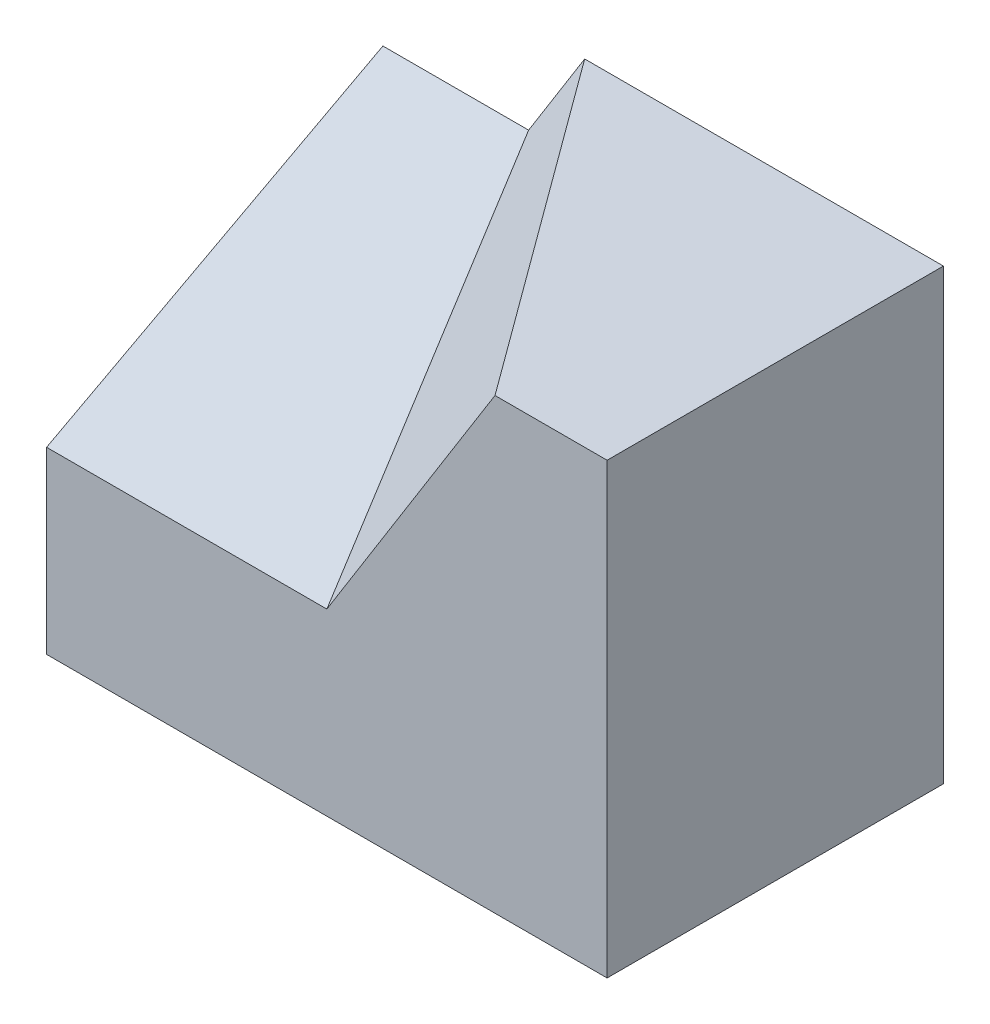
ISO-10303-21;
HEADER;
FILE_DESCRIPTION(('STEP AP214'),'2;1');
FILE_NAME('part.step','',(''),(''),'','','');
FILE_SCHEMA(('AUTOMOTIVE_DESIGN { 1 0 10303 214 1 1 1 1 }'));
ENDSEC;
DATA;
#1=APPLICATION_CONTEXT('core data for automotive mechanical design processes');
#2=APPLICATION_PROTOCOL_DEFINITION('international standard','automotive_design',2000,#1);
#3=PRODUCT_CONTEXT('',#1,'mechanical');
#4=PRODUCT('Part','Part','',(#3));
#5=PRODUCT_RELATED_PRODUCT_CATEGORY('part','',(#4));
#6=PRODUCT_DEFINITION_FORMATION('','',#4);
#7=PRODUCT_DEFINITION_CONTEXT('part definition',#1,'design');
#8=PRODUCT_DEFINITION('design','',#6,#7);
#9=PRODUCT_DEFINITION_SHAPE('','',#8);
#10=(LENGTH_UNIT() NAMED_UNIT(*) SI_UNIT(.MILLI.,.METRE.));
#11=(NAMED_UNIT(*) PLANE_ANGLE_UNIT() SI_UNIT($,.RADIAN.));
#12=(NAMED_UNIT(*) SI_UNIT($,.STERADIAN.) SOLID_ANGLE_UNIT());
#13=UNCERTAINTY_MEASURE_WITH_UNIT(LENGTH_MEASURE(1.E-05),#10,'distance_accuracy_value','');
#14=(GEOMETRIC_REPRESENTATION_CONTEXT(3) GLOBAL_UNCERTAINTY_ASSIGNED_CONTEXT((#13)) GLOBAL_UNIT_ASSIGNED_CONTEXT((#10,
#11,#12)) REPRESENTATION_CONTEXT('',''));
#15=CARTESIAN_POINT('',(0.,0.,0.));
#16=DIRECTION('',(0.,0.,1.));
#17=DIRECTION('',(1.,0.,0.));
#18=AXIS2_PLACEMENT_3D('',#15,#16,#17);
#19=CARTESIAN_POINT('',(0.,0.,60.));
#20=DIRECTION('',(0.,0.,1.));
#21=DIRECTION('',(1.,0.,0.));
#22=AXIS2_PLACEMENT_3D('',#19,#20,#21);
#23=PLANE('',#22);
#24=DIRECTION('',(0.,-1.,0.));
#25=VECTOR('',#24,1.);
#26=CARTESIAN_POINT('',(0.,32.,60.));
#27=LINE('',#26,#25);
#28=CARTESIAN_POINT('',(0.,32.,60.));
#29=VERTEX_POINT('',#28);
#30=CARTESIAN_POINT('',(0.,0.,60.));
#31=VERTEX_POINT('',#30);
#32=EDGE_CURVE('E289',#29,#31,#27,.T.);
#33=ORIENTED_EDGE('',*,*,#32,.T.);
#34=DIRECTION('',(1.,0.,0.));
#35=VECTOR('',#34,1.);
#36=CARTESIAN_POINT('',(0.,0.,60.));
#37=LINE('',#36,#35);
#38=CARTESIAN_POINT('',(100.,0.,60.));
#39=VERTEX_POINT('',#38);
#40=EDGE_CURVE('E148',#31,#39,#37,.T.);
#41=ORIENTED_EDGE('',*,*,#40,.T.);
#42=DIRECTION('',(0.,1.,0.));
#43=VECTOR('',#42,1.);
#44=CARTESIAN_POINT('',(100.,0.,60.));
#45=LINE('',#44,#43);
#46=CARTESIAN_POINT('',(100.,80.,60.));
#47=VERTEX_POINT('',#46);
#48=EDGE_CURVE('E306',#39,#47,#45,.T.);
#49=ORIENTED_EDGE('',*,*,#48,.T.);
#50=DIRECTION('',(-1.,0.,0.));
#51=VECTOR('',#50,1.);
#52=CARTESIAN_POINT('',(100.,80.,60.));
#53=LINE('',#52,#51);
#54=CARTESIAN_POINT('',(80.,80.,60.));
#55=VERTEX_POINT('',#54);
#56=EDGE_CURVE('E316',#47,#55,#53,.T.);
#57=ORIENTED_EDGE('',*,*,#56,.T.);
#58=DIRECTION('',(-0.52999894000318,-0.847998304005088,0.));
#59=VECTOR('',#58,1.);
#60=CARTESIAN_POINT('',(80.,80.,60.));
#61=LINE('',#60,#59);
#62=CARTESIAN_POINT('',(50.,32.,60.));
#63=VERTEX_POINT('',#62);
#64=EDGE_CURVE('E67',#55,#63,#61,.T.);
#65=ORIENTED_EDGE('',*,*,#64,.T.);
#66=DIRECTION('',(-1.,0.,0.));
#67=VECTOR('',#66,1.);
#68=CARTESIAN_POINT('',(50.,32.,60.));
#69=LINE('',#68,#67);
#70=EDGE_CURVE('E12',#63,#29,#69,.T.);
#71=ORIENTED_EDGE('',*,*,#70,.T.);
#72=EDGE_LOOP('',(#33,#41,#49,#57,#65,#71));
#73=FACE_BOUND('',#72,.T.);
#74=ADVANCED_FACE('F57',(#73),#23,.T.);
#75=CARTESIAN_POINT('',(0.,0.,0.));
#76=DIRECTION('',(0.,0.,1.));
#77=DIRECTION('',(1.,0.,0.));
#78=AXIS2_PLACEMENT_3D('',#75,#76,#77);
#79=PLANE('',#78);
#80=DIRECTION('',(0.,-1.,0.));
#81=VECTOR('',#80,1.);
#82=CARTESIAN_POINT('',(0.,64.,0.));
#83=LINE('',#82,#81);
#84=CARTESIAN_POINT('',(0.,64.,0.));
#85=VERTEX_POINT('',#84);
#86=CARTESIAN_POINT('',(0.,0.,0.));
#87=VERTEX_POINT('',#86);
#88=EDGE_CURVE('E119',#85,#87,#83,.T.);
#89=ORIENTED_EDGE('',*,*,#88,.F.);
#90=DIRECTION('',(-1.,0.,0.));
#91=VECTOR('',#90,1.);
#92=CARTESIAN_POINT('',(26.,64.,0.));
#93=LINE('',#92,#91);
#94=CARTESIAN_POINT('',(26.,64.,0.));
#95=VERTEX_POINT('',#94);
#96=EDGE_CURVE('E336',#95,#85,#93,.T.);
#97=ORIENTED_EDGE('',*,*,#96,.F.);
#98=DIRECTION('',(-0.52999894000318,-0.847998304005088,0.));
#99=VECTOR('',#98,1.);
#100=CARTESIAN_POINT('',(36.,80.,0.));
#101=LINE('',#100,#99);
#102=CARTESIAN_POINT('',(36.,80.,0.));
#103=VERTEX_POINT('',#102);
#104=EDGE_CURVE('E339',#103,#95,#101,.T.);
#105=ORIENTED_EDGE('',*,*,#104,.F.);
#106=DIRECTION('',(-1.,0.,0.));
#107=VECTOR('',#106,1.);
#108=CARTESIAN_POINT('',(100.,80.,0.));
#109=LINE('',#108,#107);
#110=CARTESIAN_POINT('',(100.,80.,0.));
#111=VERTEX_POINT('',#110);
#112=EDGE_CURVE('E355',#111,#103,#109,.T.);
#113=ORIENTED_EDGE('',*,*,#112,.F.);
#114=DIRECTION('',(0.,1.,0.));
#115=VECTOR('',#114,1.);
#116=CARTESIAN_POINT('',(100.,0.,0.));
#117=LINE('',#116,#115);
#118=CARTESIAN_POINT('',(100.,0.,0.));
#119=VERTEX_POINT('',#118);
#120=EDGE_CURVE('E122',#119,#111,#117,.T.);
#121=ORIENTED_EDGE('',*,*,#120,.F.);
#122=DIRECTION('',(1.,0.,0.));
#123=VECTOR('',#122,1.);
#124=CARTESIAN_POINT('',(0.,0.,0.));
#125=LINE('',#124,#123);
#126=EDGE_CURVE('E115',#87,#119,#125,.T.);
#127=ORIENTED_EDGE('',*,*,#126,.F.);
#128=EDGE_LOOP('',(#89,#97,#105,#113,#121,#127));
#129=FACE_BOUND('',#128,.T.);
#130=ADVANCED_FACE('F118',(#129),#79,.F.);
#131=CARTESIAN_POINT('',(0.,0.,0.));
#132=DIRECTION('',(0.,1.,0.));
#133=DIRECTION('',(0.,0.,1.));
#134=AXIS2_PLACEMENT_3D('',#131,#132,#133);
#135=PLANE('',#134);
#136=CARTESIAN_POINT('',(100.,0.,0.));
#137=DIRECTION('',(0.,0.,1.));
#138=VECTOR('',#137,1.);
#139=LINE('',#136,#138);
#140=EDGE_CURVE('E151',#119,#39,#139,.T.);
#141=ORIENTED_EDGE('',*,*,#140,.T.);
#142=ORIENTED_EDGE('',*,*,#40,.F.);
#143=CARTESIAN_POINT('',(0.,0.,0.));
#144=DIRECTION('',(0.,0.,1.));
#145=VECTOR('',#144,1.);
#146=LINE('',#143,#145);
#147=EDGE_CURVE('E136',#87,#31,#146,.T.);
#148=ORIENTED_EDGE('',*,*,#147,.F.);
#149=ORIENTED_EDGE('',*,*,#126,.T.);
#150=EDGE_LOOP('',(#141,#142,#148,#149));
#151=FACE_BOUND('',#150,.T.);
#152=ADVANCED_FACE('F146',(#151),#135,.F.);
#153=CARTESIAN_POINT('',(0.,0.,0.));
#154=DIRECTION('',(1.,0.,0.));
#155=DIRECTION('',(0.,0.,-1.));
#156=AXIS2_PLACEMENT_3D('',#153,#154,#155);
#157=PLANE('',#156);
#158=ORIENTED_EDGE('',*,*,#147,.T.);
#159=ORIENTED_EDGE('',*,*,#32,.F.);
#160=CARTESIAN_POINT('',(0.,64.,0.));
#161=DIRECTION('',(0.,-0.470588235294118,0.882352941176471));
#162=VECTOR('',#161,1.);
#163=LINE('',#160,#162);
#164=EDGE_CURVE('E139',#85,#29,#163,.T.);
#165=ORIENTED_EDGE('',*,*,#164,.F.);
#166=ORIENTED_EDGE('',*,*,#88,.T.);
#167=EDGE_LOOP('',(#158,#159,#165,#166));
#168=FACE_BOUND('',#167,.T.);
#169=ADVANCED_FACE('F135',(#168),#157,.F.);
#170=CARTESIAN_POINT('',(100.,0.,0.));
#171=DIRECTION('',(-1.,0.,0.));
#172=DIRECTION('',(0.,0.,1.));
#173=AXIS2_PLACEMENT_3D('',#170,#171,#172);
#174=PLANE('',#173);
#175=CARTESIAN_POINT('',(100.,80.,0.));
#176=DIRECTION('',(0.,0.,1.));
#177=VECTOR('',#176,1.);
#178=LINE('',#175,#177);
#179=EDGE_CURVE('E150',#111,#47,#178,.T.);
#180=ORIENTED_EDGE('',*,*,#179,.T.);
#181=ORIENTED_EDGE('',*,*,#48,.F.);
#182=ORIENTED_EDGE('',*,*,#140,.F.);
#183=ORIENTED_EDGE('',*,*,#120,.T.);
#184=EDGE_LOOP('',(#180,#181,#182,#183));
#185=FACE_BOUND('',#184,.T.);
#186=ADVANCED_FACE('F194',(#185),#174,.F.);
#187=CARTESIAN_POINT('',(0.,80.,0.));
#188=DIRECTION('',(0.,-1.,0.));
#189=DIRECTION('',(0.,0.,-1.));
#190=AXIS2_PLACEMENT_3D('',#187,#188,#189);
#191=PLANE('',#190);
#192=CARTESIAN_POINT('',(36.,80.,0.));
#193=DIRECTION('',(0.591363663627517,0.,0.806404995855705));
#194=VECTOR('',#193,1.);
#195=LINE('',#192,#194);
#196=EDGE_CURVE('E237',#103,#55,#195,.T.);
#197=ORIENTED_EDGE('',*,*,#196,.T.);
#198=ORIENTED_EDGE('',*,*,#56,.F.);
#199=ORIENTED_EDGE('',*,*,#179,.F.);
#200=ORIENTED_EDGE('',*,*,#112,.T.);
#201=EDGE_LOOP('',(#197,#198,#199,#200));
#202=FACE_BOUND('',#201,.T.);
#203=ADVANCED_FACE('F203',(#202),#191,.F.);
#204=CARTESIAN_POINT('',(-7.25989412654399,4.53743382909,5.3239223594656));
#205=DIRECTION('',(0.720113786968222,-0.450071116855139,-0.528083443776696));
#206=DIRECTION('',(-0.591363663627517,0.,-0.806404995855706));
#207=AXIS2_PLACEMENT_3D('',#204,#205,#206);
#208=PLANE('',#207);
#209=CARTESIAN_POINT('',(26.,64.,0.));
#210=DIRECTION('',(0.332820117735137,-0.443760156980183,0.832050294337844));
#211=VECTOR('',#210,1.);
#212=LINE('',#209,#211);
#213=EDGE_CURVE('E82',#95,#63,#212,.T.);
#214=ORIENTED_EDGE('',*,*,#213,.T.);
#215=ORIENTED_EDGE('',*,*,#64,.F.);
#216=ORIENTED_EDGE('',*,*,#196,.F.);
#217=ORIENTED_EDGE('',*,*,#104,.T.);
#218=EDGE_LOOP('',(#214,#215,#216,#217));
#219=FACE_BOUND('',#218,.T.);
#220=ADVANCED_FACE('F251',(#219),#208,.F.);
#221=CARTESIAN_POINT('',(0.,49.8269896193772,26.5743944636678));
#222=DIRECTION('',(0.,-0.882352941176471,-0.470588235294118));
#223=DIRECTION('',(0.,0.470588235294118,-0.882352941176471));
#224=AXIS2_PLACEMENT_3D('',#221,#222,#223);
#225=PLANE('',#224);
#226=ORIENTED_EDGE('',*,*,#164,.T.);
#227=ORIENTED_EDGE('',*,*,#70,.F.);
#228=ORIENTED_EDGE('',*,*,#213,.F.);
#229=ORIENTED_EDGE('',*,*,#96,.T.);
#230=EDGE_LOOP('',(#226,#227,#228,#229));
#231=FACE_BOUND('',#230,.T.);
#232=ADVANCED_FACE('F259',(#231),#225,.F.);
#233=CLOSED_SHELL('',(#74,#130,#152,#169,#186,#203,#220,#232));
#234=MANIFOLD_SOLID_BREP('B2',#233);
#235=ADVANCED_BREP_SHAPE_REPRESENTATION('',(#18,#234),#14);
#236=SHAPE_DEFINITION_REPRESENTATION(#9,#235);
ENDSEC;
END-ISO-10303-21;
